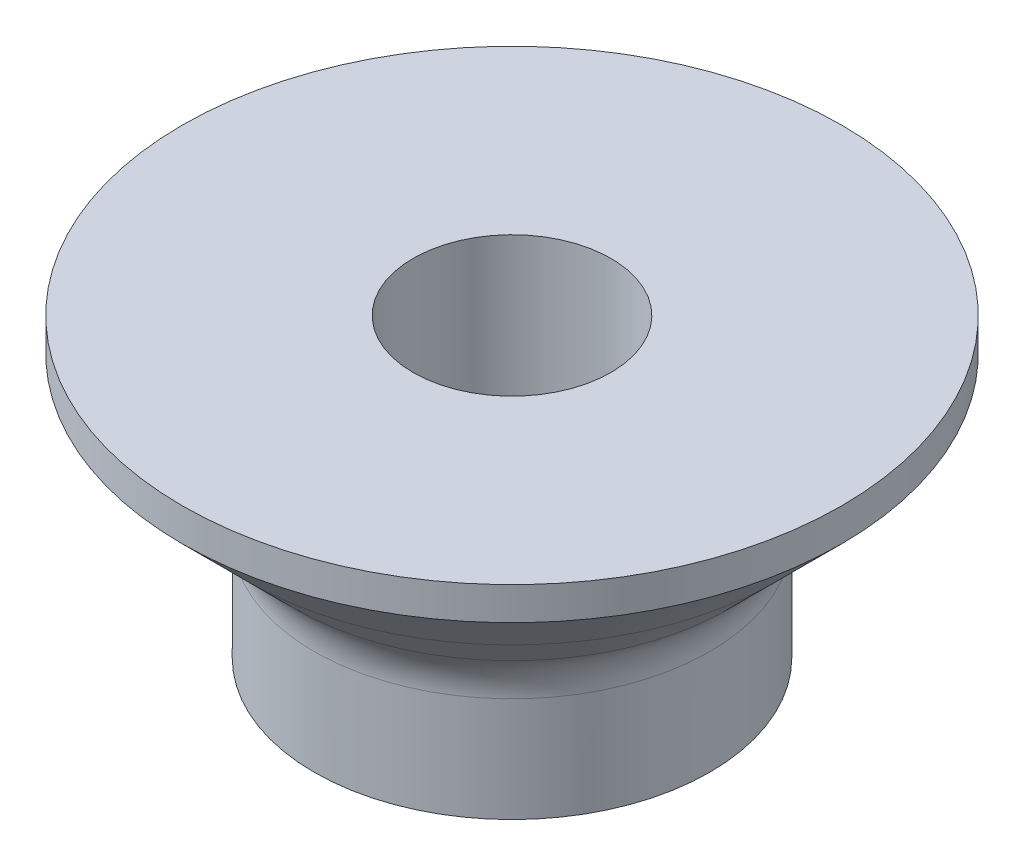
ISO-10303-21;
HEADER;
FILE_DESCRIPTION(('STEP AP214'),'2;1');
FILE_NAME('part.step','',(''),(''),'','','');
FILE_SCHEMA(('AUTOMOTIVE_DESIGN { 1 0 10303 214 1 1 1 1 }'));
ENDSEC;
DATA;
#1=APPLICATION_CONTEXT('core data for automotive mechanical design processes');
#2=APPLICATION_PROTOCOL_DEFINITION('international standard','automotive_design',2000,#1);
#3=PRODUCT_CONTEXT('',#1,'mechanical');
#4=PRODUCT('Part','Part','',(#3));
#5=PRODUCT_RELATED_PRODUCT_CATEGORY('part','',(#4));
#6=PRODUCT_DEFINITION_FORMATION('','',#4);
#7=PRODUCT_DEFINITION_CONTEXT('part definition',#1,'design');
#8=PRODUCT_DEFINITION('design','',#6,#7);
#9=PRODUCT_DEFINITION_SHAPE('','',#8);
#10=(LENGTH_UNIT() NAMED_UNIT(*) SI_UNIT(.MILLI.,.METRE.));
#11=(NAMED_UNIT(*) PLANE_ANGLE_UNIT() SI_UNIT($,.RADIAN.));
#12=(NAMED_UNIT(*) SI_UNIT($,.STERADIAN.) SOLID_ANGLE_UNIT());
#13=UNCERTAINTY_MEASURE_WITH_UNIT(LENGTH_MEASURE(1.E-05),#10,'distance_accuracy_value','');
#14=(GEOMETRIC_REPRESENTATION_CONTEXT(3) GLOBAL_UNCERTAINTY_ASSIGNED_CONTEXT((#13)) GLOBAL_UNIT_ASSIGNED_CONTEXT((#10,
#11,#12)) REPRESENTATION_CONTEXT('',''));
#15=CARTESIAN_POINT('',(0.,0.,0.));
#16=DIRECTION('',(0.,0.,1.));
#17=DIRECTION('',(1.,0.,0.));
#18=AXIS2_PLACEMENT_3D('',#15,#16,#17);
#19=CARTESIAN_POINT('',(0.,9.,0.));
#20=DIRECTION('',(0.,-1.,0.));
#21=DIRECTION('',(0.,0.,-1.));
#22=AXIS2_PLACEMENT_3D('',#19,#20,#21);
#23=CYLINDRICAL_SURFACE('',#22,6.);
#24=CARTESIAN_POINT('',(0.,3.17157287525381,0.));
#25=DIRECTION('',(0.,-1.,0.));
#26=DIRECTION('',(0.,0.,-1.));
#27=AXIS2_PLACEMENT_3D('',#24,#25,#26);
#28=CIRCLE('',#27,6.);
#29=CARTESIAN_POINT('',(0.,3.17157287525381,-6.));
#30=VERTEX_POINT('',#29);
#31=EDGE_CURVE('E44',#30,#30,#28,.T.);
#32=ORIENTED_EDGE('',*,*,#31,.T.);
#33=EDGE_LOOP('',(#32));
#34=FACE_BOUND('',#33,.T.);
#35=CARTESIAN_POINT('',(0.,0.,0.));
#36=DIRECTION('',(0.,1.,0.));
#37=DIRECTION('',(0.,0.,1.));
#38=AXIS2_PLACEMENT_3D('',#35,#36,#37);
#39=CIRCLE('',#38,6.);
#40=CARTESIAN_POINT('',(0.,0.,6.));
#41=VERTEX_POINT('',#40);
#42=EDGE_CURVE('E52',#41,#41,#39,.T.);
#43=ORIENTED_EDGE('',*,*,#42,.T.);
#44=EDGE_LOOP('',(#43));
#45=FACE_BOUND('',#44,.T.);
#46=ADVANCED_FACE('F37',(#34,#45),#23,.T.);
#47=CARTESIAN_POINT('',(0.,9.,0.));
#48=DIRECTION('',(0.,1.,0.));
#49=DIRECTION('',(0.,0.,1.));
#50=AXIS2_PLACEMENT_3D('',#47,#48,#49);
#51=PLANE('',#50);
#52=CARTESIAN_POINT('',(0.,9.,0.));
#53=DIRECTION('',(0.,1.,0.));
#54=DIRECTION('',(0.,0.,1.));
#55=AXIS2_PLACEMENT_3D('',#52,#53,#54);
#56=CIRCLE('',#55,3.);
#57=CARTESIAN_POINT('',(0.,9.,3.));
#58=VERTEX_POINT('',#57);
#59=EDGE_CURVE('E61',#58,#58,#56,.T.);
#60=ORIENTED_EDGE('',*,*,#59,.F.);
#61=EDGE_LOOP('',(#60));
#62=FACE_BOUND('',#61,.T.);
#63=CARTESIAN_POINT('',(0.,9.,0.));
#64=DIRECTION('',(0.,1.,0.));
#65=DIRECTION('',(0.,0.,1.));
#66=AXIS2_PLACEMENT_3D('',#63,#64,#65);
#67=CIRCLE('',#66,10.);
#68=CARTESIAN_POINT('',(0.,9.,10.));
#69=VERTEX_POINT('',#68);
#70=EDGE_CURVE('E57',#69,#69,#67,.T.);
#71=ORIENTED_EDGE('',*,*,#70,.T.);
#72=EDGE_LOOP('',(#71));
#73=FACE_BOUND('',#72,.T.);
#74=ADVANCED_FACE('F70',(#62,#73),#51,.T.);
#75=CARTESIAN_POINT('',(0.,0.,0.));
#76=DIRECTION('',(0.,1.,0.));
#77=DIRECTION('',(0.,0.,1.));
#78=AXIS2_PLACEMENT_3D('',#75,#76,#77);
#79=PLANE('',#78);
#80=ORIENTED_EDGE('',*,*,#42,.F.);
#81=EDGE_LOOP('',(#80));
#82=FACE_BOUND('',#81,.T.);
#83=CARTESIAN_POINT('',(0.,0.,0.));
#84=DIRECTION('',(0.,1.,0.));
#85=DIRECTION('',(0.,0.,1.));
#86=AXIS2_PLACEMENT_3D('',#83,#84,#85);
#87=CIRCLE('',#86,3.);
#88=CARTESIAN_POINT('',(0.,0.,3.));
#89=VERTEX_POINT('',#88);
#90=EDGE_CURVE('E62',#89,#89,#87,.T.);
#91=ORIENTED_EDGE('',*,*,#90,.T.);
#92=EDGE_LOOP('',(#91));
#93=FACE_BOUND('',#92,.T.);
#94=ADVANCED_FACE('F83',(#82,#93),#79,.F.);
#95=CARTESIAN_POINT('',(0.,9.,0.));
#96=DIRECTION('',(0.,-1.,0.));
#97=DIRECTION('',(0.,0.,-1.));
#98=AXIS2_PLACEMENT_3D('',#95,#96,#97);
#99=CYLINDRICAL_SURFACE('',#98,3.);
#100=ORIENTED_EDGE('',*,*,#59,.T.);
#101=EDGE_LOOP('',(#100));
#102=FACE_BOUND('',#101,.T.);
#103=ORIENTED_EDGE('',*,*,#90,.F.);
#104=EDGE_LOOP('',(#103));
#105=FACE_BOUND('',#104,.T.);
#106=ADVANCED_FACE('F75',(#102,#105),#99,.F.);
#107=CARTESIAN_POINT('',(0.,6.,0.));
#108=DIRECTION('',(0.,1.,0.));
#109=DIRECTION('',(0.,0.,1.));
#110=AXIS2_PLACEMENT_3D('',#107,#108,#109);
#111=CYLINDRICAL_SURFACE('',#110,10.);
#112=CARTESIAN_POINT('',(0.,8.,0.));
#113=DIRECTION('',(0.,1.,0.));
#114=DIRECTION('',(0.,0.,1.));
#115=AXIS2_PLACEMENT_3D('',#112,#113,#114);
#116=CIRCLE('',#115,10.);
#117=CARTESIAN_POINT('',(0.,8.,10.));
#118=VERTEX_POINT('',#117);
#119=EDGE_CURVE('E48',#118,#118,#116,.T.);
#120=ORIENTED_EDGE('',*,*,#119,.T.);
#121=EDGE_LOOP('',(#120));
#122=FACE_BOUND('',#121,.T.);
#123=ORIENTED_EDGE('',*,*,#70,.F.);
#124=EDGE_LOOP('',(#123));
#125=FACE_BOUND('',#124,.T.);
#126=ADVANCED_FACE('F72',(#122,#125),#111,.T.);
#127=CARTESIAN_POINT('',(0.,6.,0.));
#128=DIRECTION('',(0.,1.,0.));
#129=DIRECTION('',(0.,0.,1.));
#130=AXIS2_PLACEMENT_3D('',#127,#128,#129);
#131=CONICAL_SURFACE('',#130,8.00000000000001,0.785398163397453);
#132=CARTESIAN_POINT('',(0.,4.58578643762691,0.));
#133=DIRECTION('',(0.,1.,0.));
#134=DIRECTION('',(0.,0.,1.));
#135=AXIS2_PLACEMENT_3D('',#132,#133,#134);
#136=CIRCLE('',#135,6.58578643762691);
#137=CARTESIAN_POINT('',(0.,4.58578643762691,6.58578643762691));
#138=VERTEX_POINT('',#137);
#139=EDGE_CURVE('E10',#138,#138,#136,.T.);
#140=ORIENTED_EDGE('',*,*,#139,.T.);
#141=EDGE_LOOP('',(#140));
#142=FACE_BOUND('',#141,.T.);
#143=CARTESIAN_POINT('',(0.,6.,0.));
#144=DIRECTION('',(0.,1.,0.));
#145=DIRECTION('',(0.,0.,1.));
#146=AXIS2_PLACEMENT_3D('',#143,#144,#145);
#147=CIRCLE('',#146,8.00000000000001);
#148=CARTESIAN_POINT('',(0.,6.,8.00000000000001));
#149=VERTEX_POINT('',#148);
#150=EDGE_CURVE('E55',#149,#149,#147,.T.);
#151=ORIENTED_EDGE('',*,*,#150,.F.);
#152=EDGE_LOOP('',(#151));
#153=FACE_BOUND('',#152,.T.);
#154=ADVANCED_FACE('F74',(#142,#153),#131,.T.);
#155=CARTESIAN_POINT('',(0.,8.,0.));
#156=DIRECTION('',(0.,1.,0.));
#157=DIRECTION('',(0.,0.,1.));
#158=AXIS2_PLACEMENT_3D('',#155,#156,#157);
#159=CONICAL_SURFACE('',#158,10.,0.78539816339745);
#160=ORIENTED_EDGE('',*,*,#150,.T.);
#161=EDGE_LOOP('',(#160));
#162=FACE_BOUND('',#161,.T.);
#163=ORIENTED_EDGE('',*,*,#119,.F.);
#164=EDGE_LOOP('',(#163));
#165=FACE_BOUND('',#164,.T.);
#166=ADVANCED_FACE('F82',(#162,#165),#159,.T.);
#167=CARTESIAN_POINT('',(0.,3.17157287525381,0.));
#168=DIRECTION('',(0.,-1.,0.));
#169=DIRECTION('',(0.,0.,-1.));
#170=AXIS2_PLACEMENT_3D('',#167,#168,#169);
#171=TOROIDAL_SURFACE('',#170,8.,2.);
#172=ORIENTED_EDGE('',*,*,#139,.F.);
#173=EDGE_LOOP('',(#172));
#174=FACE_BOUND('',#173,.T.);
#175=ORIENTED_EDGE('',*,*,#31,.F.);
#176=EDGE_LOOP('',(#175));
#177=FACE_BOUND('',#176,.T.);
#178=ADVANCED_FACE('F39',(#174,#177),#171,.F.);
#179=CLOSED_SHELL('',(#46,#74,#94,#106,#126,#154,#166,#178));
#180=MANIFOLD_SOLID_BREP('B2',#179);
#181=ADVANCED_BREP_SHAPE_REPRESENTATION('',(#18,#180),#14);
#182=SHAPE_DEFINITION_REPRESENTATION(#9,#181);
ENDSEC;
END-ISO-10303-21;
